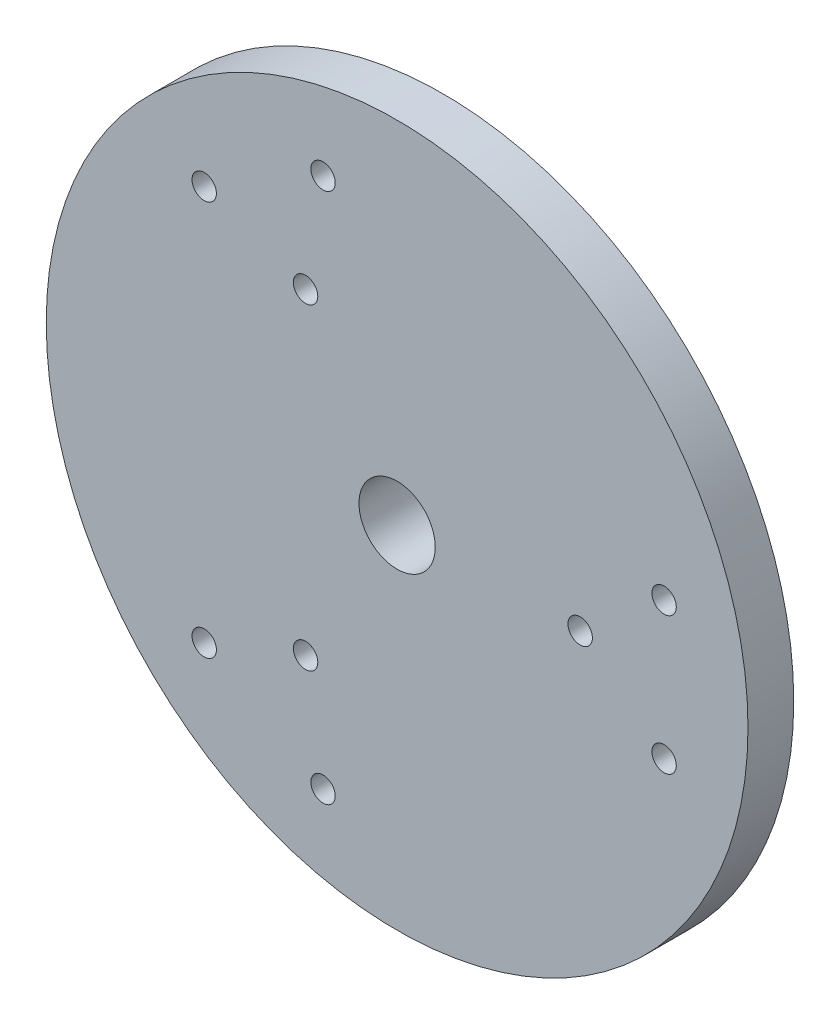
ISO-10303-21;
HEADER;
FILE_DESCRIPTION(('STEP AP214'),'2;1');
FILE_NAME('part.step','',(''),(''),'','','');
FILE_SCHEMA(('AUTOMOTIVE_DESIGN { 1 0 10303 214 1 1 1 1 }'));
ENDSEC;
DATA;
#1=APPLICATION_CONTEXT('core data for automotive mechanical design processes');
#2=APPLICATION_PROTOCOL_DEFINITION('international standard','automotive_design',2000,#1);
#3=PRODUCT_CONTEXT('',#1,'mechanical');
#4=PRODUCT('Part','Part','',(#3));
#5=PRODUCT_RELATED_PRODUCT_CATEGORY('part','',(#4));
#6=PRODUCT_DEFINITION_FORMATION('','',#4);
#7=PRODUCT_DEFINITION_CONTEXT('part definition',#1,'design');
#8=PRODUCT_DEFINITION('design','',#6,#7);
#9=PRODUCT_DEFINITION_SHAPE('','',#8);
#10=(LENGTH_UNIT() NAMED_UNIT(*) SI_UNIT(.MILLI.,.METRE.));
#11=(NAMED_UNIT(*) PLANE_ANGLE_UNIT() SI_UNIT($,.RADIAN.));
#12=(NAMED_UNIT(*) SI_UNIT($,.STERADIAN.) SOLID_ANGLE_UNIT());
#13=UNCERTAINTY_MEASURE_WITH_UNIT(LENGTH_MEASURE(1.E-05),#10,'distance_accuracy_value','');
#14=(GEOMETRIC_REPRESENTATION_CONTEXT(3) GLOBAL_UNCERTAINTY_ASSIGNED_CONTEXT((#13)) GLOBAL_UNIT_ASSIGNED_CONTEXT((#10,
#11,#12)) REPRESENTATION_CONTEXT('',''));
#15=CARTESIAN_POINT('',(0.,0.,0.));
#16=DIRECTION('',(0.,0.,1.));
#17=DIRECTION('',(1.,0.,0.));
#18=AXIS2_PLACEMENT_3D('',#15,#16,#17);
#19=CARTESIAN_POINT('',(0.,26.,24.));
#20=DIRECTION('',(0.,0.,-1.));
#21=DIRECTION('',(-1.,0.,0.));
#22=AXIS2_PLACEMENT_3D('',#19,#20,#21);
#23=CYLINDRICAL_SURFACE('',#22,46.);
#24=CARTESIAN_POINT('',(0.,26.,24.));
#25=DIRECTION('',(0.,0.,1.));
#26=DIRECTION('',(1.,0.,0.));
#27=AXIS2_PLACEMENT_3D('',#24,#25,#26);
#28=CIRCLE('',#27,46.);
#29=CARTESIAN_POINT('',(46.,26.,24.));
#30=VERTEX_POINT('',#29);
#31=EDGE_CURVE('E10',#30,#30,#28,.T.);
#32=ORIENTED_EDGE('',*,*,#31,.F.);
#33=EDGE_LOOP('',(#32));
#34=FACE_BOUND('',#33,.T.);
#35=CARTESIAN_POINT('',(0.,26.,18.));
#36=DIRECTION('',(0.,0.,1.));
#37=DIRECTION('',(1.,0.,0.));
#38=AXIS2_PLACEMENT_3D('',#35,#36,#37);
#39=CIRCLE('',#38,46.);
#40=CARTESIAN_POINT('',(46.,26.,18.));
#41=VERTEX_POINT('',#40);
#42=EDGE_CURVE('E46',#41,#41,#39,.T.);
#43=ORIENTED_EDGE('',*,*,#42,.T.);
#44=EDGE_LOOP('',(#43));
#45=FACE_BOUND('',#44,.T.);
#46=ADVANCED_FACE('F39',(#34,#45),#23,.T.);
#47=CARTESIAN_POINT('',(0.,26.,24.));
#48=DIRECTION('',(0.,0.,1.));
#49=DIRECTION('',(1.,0.,0.));
#50=AXIS2_PLACEMENT_3D('',#47,#48,#49);
#51=PLANE('',#50);
#52=CARTESIAN_POINT('',(0.,26.,24.));
#53=DIRECTION('',(0.,0.,1.));
#54=DIRECTION('',(1.,0.,0.));
#55=AXIS2_PLACEMENT_3D('',#52,#53,#54);
#56=CIRCLE('',#55,5.);
#57=CARTESIAN_POINT('',(5.,26.,24.));
#58=VERTEX_POINT('',#57);
#59=EDGE_CURVE('E116',#58,#58,#56,.T.);
#60=ORIENTED_EDGE('',*,*,#59,.F.);
#61=EDGE_LOOP('',(#60));
#62=FACE_BOUND('',#61,.T.);
#63=CARTESIAN_POINT('',(35.,35.,24.));
#64=DIRECTION('',(0.,0.,1.));
#65=DIRECTION('',(1.,0.,0.));
#66=AXIS2_PLACEMENT_3D('',#63,#64,#65);
#67=CIRCLE('',#66,1.6);
#68=CARTESIAN_POINT('',(36.6,35.,24.));
#69=VERTEX_POINT('',#68);
#70=EDGE_CURVE('E94',#69,#69,#67,.T.);
#71=ORIENTED_EDGE('',*,*,#70,.F.);
#72=EDGE_LOOP('',(#71));
#73=FACE_BOUND('',#72,.T.);
#74=CARTESIAN_POINT('',(35.,17.,24.));
#75=DIRECTION('',(0.,0.,1.));
#76=DIRECTION('',(1.,0.,0.));
#77=AXIS2_PLACEMENT_3D('',#74,#75,#76);
#78=CIRCLE('',#77,1.6);
#79=CARTESIAN_POINT('',(36.6,17.,24.));
#80=VERTEX_POINT('',#79);
#81=EDGE_CURVE('E105',#80,#80,#78,.T.);
#82=ORIENTED_EDGE('',*,*,#81,.F.);
#83=EDGE_LOOP('',(#82));
#84=FACE_BOUND('',#83,.T.);
#85=CARTESIAN_POINT('',(-12.,46.78,24.));
#86=DIRECTION('',(0.,0.,1.));
#87=DIRECTION('',(1.,0.,0.));
#88=AXIS2_PLACEMENT_3D('',#85,#86,#87);
#89=CIRCLE('',#88,1.6);
#90=CARTESIAN_POINT('',(-10.4,46.78,24.));
#91=VERTEX_POINT('',#90);
#92=EDGE_CURVE('E98',#91,#91,#89,.T.);
#93=ORIENTED_EDGE('',*,*,#92,.F.);
#94=EDGE_LOOP('',(#93));
#95=FACE_BOUND('',#94,.T.);
#96=CARTESIAN_POINT('',(-25.29,51.81,24.));
#97=DIRECTION('',(0.,0.,1.));
#98=DIRECTION('',(1.,0.,0.));
#99=AXIS2_PLACEMENT_3D('',#96,#97,#98);
#100=CIRCLE('',#99,1.6);
#101=CARTESIAN_POINT('',(-23.69,51.81,24.));
#102=VERTEX_POINT('',#101);
#103=EDGE_CURVE('E92',#102,#102,#100,.T.);
#104=ORIENTED_EDGE('',*,*,#103,.F.);
#105=EDGE_LOOP('',(#104));
#106=FACE_BOUND('',#105,.T.);
#107=CARTESIAN_POINT('',(-9.71,60.81,24.));
#108=DIRECTION('',(0.,0.,1.));
#109=DIRECTION('',(1.,0.,0.));
#110=AXIS2_PLACEMENT_3D('',#107,#108,#109);
#111=CIRCLE('',#110,1.6);
#112=CARTESIAN_POINT('',(-8.11,60.81,24.));
#113=VERTEX_POINT('',#112);
#114=EDGE_CURVE('E97',#113,#113,#111,.T.);
#115=ORIENTED_EDGE('',*,*,#114,.F.);
#116=EDGE_LOOP('',(#115));
#117=FACE_BOUND('',#116,.T.);
#118=CARTESIAN_POINT('',(-12.,5.22,24.));
#119=DIRECTION('',(0.,0.,1.));
#120=DIRECTION('',(1.,0.,0.));
#121=AXIS2_PLACEMENT_3D('',#118,#119,#120);
#122=CIRCLE('',#121,1.6);
#123=CARTESIAN_POINT('',(-10.4,5.22,24.));
#124=VERTEX_POINT('',#123);
#125=EDGE_CURVE('E114',#124,#124,#122,.T.);
#126=ORIENTED_EDGE('',*,*,#125,.F.);
#127=EDGE_LOOP('',(#126));
#128=FACE_BOUND('',#127,.T.);
#129=CARTESIAN_POINT('',(-9.71,-8.81,24.));
#130=DIRECTION('',(0.,0.,1.));
#131=DIRECTION('',(1.,0.,0.));
#132=AXIS2_PLACEMENT_3D('',#129,#130,#131);
#133=CIRCLE('',#132,1.6);
#134=CARTESIAN_POINT('',(-8.11,-8.81,24.));
#135=VERTEX_POINT('',#134);
#136=EDGE_CURVE('E109',#135,#135,#133,.T.);
#137=ORIENTED_EDGE('',*,*,#136,.F.);
#138=EDGE_LOOP('',(#137));
#139=FACE_BOUND('',#138,.T.);
#140=CARTESIAN_POINT('',(-25.29,0.,24.));
#141=DIRECTION('',(0.,0.,1.));
#142=DIRECTION('',(1.,0.,0.));
#143=AXIS2_PLACEMENT_3D('',#140,#141,#142);
#144=CIRCLE('',#143,1.6);
#145=CARTESIAN_POINT('',(-23.69,0.,24.));
#146=VERTEX_POINT('',#145);
#147=EDGE_CURVE('E110',#146,#146,#144,.T.);
#148=ORIENTED_EDGE('',*,*,#147,.F.);
#149=EDGE_LOOP('',(#148));
#150=FACE_BOUND('',#149,.T.);
#151=CARTESIAN_POINT('',(24.,26.,24.));
#152=DIRECTION('',(0.,0.,1.));
#153=DIRECTION('',(1.,0.,0.));
#154=AXIS2_PLACEMENT_3D('',#151,#152,#153);
#155=CIRCLE('',#154,1.6);
#156=CARTESIAN_POINT('',(25.6,26.,24.));
#157=VERTEX_POINT('',#156);
#158=EDGE_CURVE('E63',#157,#157,#155,.T.);
#159=ORIENTED_EDGE('',*,*,#158,.F.);
#160=EDGE_LOOP('',(#159));
#161=FACE_BOUND('',#160,.T.);
#162=ORIENTED_EDGE('',*,*,#31,.T.);
#163=EDGE_LOOP('',(#162));
#164=FACE_BOUND('',#163,.T.);
#165=ADVANCED_FACE('F148',(#62,#73,#84,#95,#106,#117,#128,#139,#150,#161,#164),#51,.T.);
#166=CARTESIAN_POINT('',(0.,26.,18.));
#167=DIRECTION('',(0.,0.,1.));
#168=DIRECTION('',(1.,0.,0.));
#169=AXIS2_PLACEMENT_3D('',#166,#167,#168);
#170=PLANE('',#169);
#171=CARTESIAN_POINT('',(35.,35.,18.));
#172=DIRECTION('',(0.,0.,1.));
#173=DIRECTION('',(1.,0.,0.));
#174=AXIS2_PLACEMENT_3D('',#171,#172,#173);
#175=CIRCLE('',#174,1.6);
#176=CARTESIAN_POINT('',(36.6,35.,18.));
#177=VERTEX_POINT('',#176);
#178=EDGE_CURVE('E83',#177,#177,#175,.F.);
#179=ORIENTED_EDGE('',*,*,#178,.F.);
#180=EDGE_LOOP('',(#179));
#181=FACE_BOUND('',#180,.T.);
#182=CARTESIAN_POINT('',(35.,17.,18.));
#183=DIRECTION('',(0.,0.,1.));
#184=DIRECTION('',(1.,0.,0.));
#185=AXIS2_PLACEMENT_3D('',#182,#183,#184);
#186=CIRCLE('',#185,1.6);
#187=CARTESIAN_POINT('',(36.6,17.,18.));
#188=VERTEX_POINT('',#187);
#189=EDGE_CURVE('E79',#188,#188,#186,.F.);
#190=ORIENTED_EDGE('',*,*,#189,.F.);
#191=EDGE_LOOP('',(#190));
#192=FACE_BOUND('',#191,.T.);
#193=CARTESIAN_POINT('',(-12.,46.78,18.));
#194=DIRECTION('',(0.,0.,1.));
#195=DIRECTION('',(1.,0.,0.));
#196=AXIS2_PLACEMENT_3D('',#193,#194,#195);
#197=CIRCLE('',#196,1.6);
#198=CARTESIAN_POINT('',(-10.4,46.78,18.));
#199=VERTEX_POINT('',#198);
#200=EDGE_CURVE('E78',#199,#199,#197,.F.);
#201=ORIENTED_EDGE('',*,*,#200,.F.);
#202=EDGE_LOOP('',(#201));
#203=FACE_BOUND('',#202,.T.);
#204=CARTESIAN_POINT('',(-25.29,51.81,18.));
#205=DIRECTION('',(0.,0.,1.));
#206=DIRECTION('',(1.,0.,0.));
#207=AXIS2_PLACEMENT_3D('',#204,#205,#206);
#208=CIRCLE('',#207,1.6);
#209=CARTESIAN_POINT('',(-23.69,51.81,18.));
#210=VERTEX_POINT('',#209);
#211=EDGE_CURVE('E71',#210,#210,#208,.F.);
#212=ORIENTED_EDGE('',*,*,#211,.F.);
#213=EDGE_LOOP('',(#212));
#214=FACE_BOUND('',#213,.T.);
#215=CARTESIAN_POINT('',(-9.71,60.81,18.));
#216=DIRECTION('',(0.,0.,1.));
#217=DIRECTION('',(1.,0.,0.));
#218=AXIS2_PLACEMENT_3D('',#215,#216,#217);
#219=CIRCLE('',#218,1.6);
#220=CARTESIAN_POINT('',(-8.11,60.81,18.));
#221=VERTEX_POINT('',#220);
#222=EDGE_CURVE('E66',#221,#221,#219,.F.);
#223=ORIENTED_EDGE('',*,*,#222,.F.);
#224=EDGE_LOOP('',(#223));
#225=FACE_BOUND('',#224,.T.);
#226=CARTESIAN_POINT('',(-12.,5.22,18.));
#227=DIRECTION('',(0.,0.,1.));
#228=DIRECTION('',(1.,0.,0.));
#229=AXIS2_PLACEMENT_3D('',#226,#227,#228);
#230=CIRCLE('',#229,1.6);
#231=CARTESIAN_POINT('',(-10.4,5.22,18.));
#232=VERTEX_POINT('',#231);
#233=EDGE_CURVE('E69',#232,#232,#230,.F.);
#234=ORIENTED_EDGE('',*,*,#233,.F.);
#235=EDGE_LOOP('',(#234));
#236=FACE_BOUND('',#235,.T.);
#237=CARTESIAN_POINT('',(-9.71,-8.81,18.));
#238=DIRECTION('',(0.,0.,1.));
#239=DIRECTION('',(1.,0.,0.));
#240=AXIS2_PLACEMENT_3D('',#237,#238,#239);
#241=CIRCLE('',#240,1.6);
#242=CARTESIAN_POINT('',(-8.11,-8.81,18.));
#243=VERTEX_POINT('',#242);
#244=EDGE_CURVE('E64',#243,#243,#241,.F.);
#245=ORIENTED_EDGE('',*,*,#244,.F.);
#246=EDGE_LOOP('',(#245));
#247=FACE_BOUND('',#246,.T.);
#248=CARTESIAN_POINT('',(-25.29,0.,18.));
#249=DIRECTION('',(0.,0.,1.));
#250=DIRECTION('',(1.,0.,0.));
#251=AXIS2_PLACEMENT_3D('',#248,#249,#250);
#252=CIRCLE('',#251,1.6);
#253=CARTESIAN_POINT('',(-23.69,0.,18.));
#254=VERTEX_POINT('',#253);
#255=EDGE_CURVE('E58',#254,#254,#252,.F.);
#256=ORIENTED_EDGE('',*,*,#255,.F.);
#257=EDGE_LOOP('',(#256));
#258=FACE_BOUND('',#257,.T.);
#259=CARTESIAN_POINT('',(24.,26.,18.));
#260=DIRECTION('',(0.,0.,1.));
#261=DIRECTION('',(1.,0.,0.));
#262=AXIS2_PLACEMENT_3D('',#259,#260,#261);
#263=CIRCLE('',#262,1.6);
#264=CARTESIAN_POINT('',(25.6,26.,18.));
#265=VERTEX_POINT('',#264);
#266=EDGE_CURVE('E60',#265,#265,#263,.F.);
#267=ORIENTED_EDGE('',*,*,#266,.F.);
#268=EDGE_LOOP('',(#267));
#269=FACE_BOUND('',#268,.T.);
#270=CARTESIAN_POINT('',(0.,26.,18.));
#271=DIRECTION('',(0.,0.,1.));
#272=DIRECTION('',(1.,0.,0.));
#273=AXIS2_PLACEMENT_3D('',#270,#271,#272);
#274=CIRCLE('',#273,14.);
#275=CARTESIAN_POINT('',(14.,26.,18.));
#276=VERTEX_POINT('',#275);
#277=EDGE_CURVE('E51',#276,#276,#274,.T.);
#278=ORIENTED_EDGE('',*,*,#277,.T.);
#279=EDGE_LOOP('',(#278));
#280=FACE_BOUND('',#279,.T.);
#281=ORIENTED_EDGE('',*,*,#42,.F.);
#282=EDGE_LOOP('',(#281));
#283=FACE_BOUND('',#282,.T.);
#284=ADVANCED_FACE('F142',(#181,#192,#203,#214,#225,#236,#247,#258,#269,#280,#283),#170,.F.);
#285=CARTESIAN_POINT('',(0.,26.,18.));
#286=DIRECTION('',(0.,0.,-1.));
#287=DIRECTION('',(-1.,0.,0.));
#288=AXIS2_PLACEMENT_3D('',#285,#286,#287);
#289=CYLINDRICAL_SURFACE('',#288,14.);
#290=ORIENTED_EDGE('',*,*,#277,.F.);
#291=EDGE_LOOP('',(#290));
#292=FACE_BOUND('',#291,.T.);
#293=CARTESIAN_POINT('',(0.,26.,12.));
#294=DIRECTION('',(0.,0.,1.));
#295=DIRECTION('',(1.,0.,0.));
#296=AXIS2_PLACEMENT_3D('',#293,#294,#295);
#297=CIRCLE('',#296,14.);
#298=CARTESIAN_POINT('',(14.,26.,12.));
#299=VERTEX_POINT('',#298);
#300=EDGE_CURVE('E53',#299,#299,#297,.T.);
#301=ORIENTED_EDGE('',*,*,#300,.T.);
#302=EDGE_LOOP('',(#301));
#303=FACE_BOUND('',#302,.T.);
#304=ADVANCED_FACE('F133',(#292,#303),#289,.T.);
#305=CARTESIAN_POINT('',(0.,26.,12.));
#306=DIRECTION('',(0.,0.,1.));
#307=DIRECTION('',(1.,0.,0.));
#308=AXIS2_PLACEMENT_3D('',#305,#306,#307);
#309=PLANE('',#308);
#310=CARTESIAN_POINT('',(0.,26.,12.));
#311=DIRECTION('',(0.,0.,1.));
#312=DIRECTION('',(1.,0.,0.));
#313=AXIS2_PLACEMENT_3D('',#310,#311,#312);
#314=CIRCLE('',#313,5.);
#315=CARTESIAN_POINT('',(5.,26.,12.));
#316=VERTEX_POINT('',#315);
#317=EDGE_CURVE('E45',#316,#316,#314,.F.);
#318=ORIENTED_EDGE('',*,*,#317,.F.);
#319=EDGE_LOOP('',(#318));
#320=FACE_BOUND('',#319,.T.);
#321=ORIENTED_EDGE('',*,*,#300,.F.);
#322=EDGE_LOOP('',(#321));
#323=FACE_BOUND('',#322,.T.);
#324=ADVANCED_FACE('F130',(#320,#323),#309,.F.);
#325=CARTESIAN_POINT('',(24.,26.,24.));
#326=DIRECTION('',(0.,0.,-1.));
#327=DIRECTION('',(-1.,0.,0.));
#328=AXIS2_PLACEMENT_3D('',#325,#326,#327);
#329=CYLINDRICAL_SURFACE('',#328,1.6);
#330=ORIENTED_EDGE('',*,*,#158,.T.);
#331=EDGE_LOOP('',(#330));
#332=FACE_BOUND('',#331,.T.);
#333=ORIENTED_EDGE('',*,*,#266,.T.);
#334=EDGE_LOOP('',(#333));
#335=FACE_BOUND('',#334,.T.);
#336=ADVANCED_FACE('F128',(#332,#335),#329,.F.);
#337=CARTESIAN_POINT('',(-25.29,0.,24.));
#338=DIRECTION('',(0.,0.,-1.));
#339=DIRECTION('',(-1.,0.,0.));
#340=AXIS2_PLACEMENT_3D('',#337,#338,#339);
#341=CYLINDRICAL_SURFACE('',#340,1.6);
#342=ORIENTED_EDGE('',*,*,#147,.T.);
#343=EDGE_LOOP('',(#342));
#344=FACE_BOUND('',#343,.T.);
#345=ORIENTED_EDGE('',*,*,#255,.T.);
#346=EDGE_LOOP('',(#345));
#347=FACE_BOUND('',#346,.T.);
#348=ADVANCED_FACE('F137',(#344,#347),#341,.F.);
#349=CARTESIAN_POINT('',(-9.71,-8.81,24.));
#350=DIRECTION('',(0.,0.,-1.));
#351=DIRECTION('',(-1.,0.,0.));
#352=AXIS2_PLACEMENT_3D('',#349,#350,#351);
#353=CYLINDRICAL_SURFACE('',#352,1.6);
#354=ORIENTED_EDGE('',*,*,#136,.T.);
#355=EDGE_LOOP('',(#354));
#356=FACE_BOUND('',#355,.T.);
#357=ORIENTED_EDGE('',*,*,#244,.T.);
#358=EDGE_LOOP('',(#357));
#359=FACE_BOUND('',#358,.T.);
#360=ADVANCED_FACE('F177',(#356,#359),#353,.F.);
#361=CARTESIAN_POINT('',(-12.,5.22,24.));
#362=DIRECTION('',(0.,0.,-1.));
#363=DIRECTION('',(-1.,0.,0.));
#364=AXIS2_PLACEMENT_3D('',#361,#362,#363);
#365=CYLINDRICAL_SURFACE('',#364,1.6);
#366=ORIENTED_EDGE('',*,*,#125,.T.);
#367=EDGE_LOOP('',(#366));
#368=FACE_BOUND('',#367,.T.);
#369=ORIENTED_EDGE('',*,*,#233,.T.);
#370=EDGE_LOOP('',(#369));
#371=FACE_BOUND('',#370,.T.);
#372=ADVANCED_FACE('F184',(#368,#371),#365,.F.);
#373=CARTESIAN_POINT('',(-9.71,60.81,24.));
#374=DIRECTION('',(0.,0.,-1.));
#375=DIRECTION('',(-1.,0.,0.));
#376=AXIS2_PLACEMENT_3D('',#373,#374,#375);
#377=CYLINDRICAL_SURFACE('',#376,1.6);
#378=ORIENTED_EDGE('',*,*,#114,.T.);
#379=EDGE_LOOP('',(#378));
#380=FACE_BOUND('',#379,.T.);
#381=ORIENTED_EDGE('',*,*,#222,.T.);
#382=EDGE_LOOP('',(#381));
#383=FACE_BOUND('',#382,.T.);
#384=ADVANCED_FACE('F201',(#380,#383),#377,.F.);
#385=CARTESIAN_POINT('',(-25.29,51.81,24.));
#386=DIRECTION('',(0.,0.,-1.));
#387=DIRECTION('',(-1.,0.,0.));
#388=AXIS2_PLACEMENT_3D('',#385,#386,#387);
#389=CYLINDRICAL_SURFACE('',#388,1.6);
#390=ORIENTED_EDGE('',*,*,#103,.T.);
#391=EDGE_LOOP('',(#390));
#392=FACE_BOUND('',#391,.T.);
#393=ORIENTED_EDGE('',*,*,#211,.T.);
#394=EDGE_LOOP('',(#393));
#395=FACE_BOUND('',#394,.T.);
#396=ADVANCED_FACE('F199',(#392,#395),#389,.F.);
#397=CARTESIAN_POINT('',(-12.,46.78,24.));
#398=DIRECTION('',(0.,0.,-1.));
#399=DIRECTION('',(-1.,0.,0.));
#400=AXIS2_PLACEMENT_3D('',#397,#398,#399);
#401=CYLINDRICAL_SURFACE('',#400,1.6);
#402=ORIENTED_EDGE('',*,*,#92,.T.);
#403=EDGE_LOOP('',(#402));
#404=FACE_BOUND('',#403,.T.);
#405=ORIENTED_EDGE('',*,*,#200,.T.);
#406=EDGE_LOOP('',(#405));
#407=FACE_BOUND('',#406,.T.);
#408=ADVANCED_FACE('F198',(#404,#407),#401,.F.);
#409=CARTESIAN_POINT('',(35.,17.,24.));
#410=DIRECTION('',(0.,0.,-1.));
#411=DIRECTION('',(-1.,0.,0.));
#412=AXIS2_PLACEMENT_3D('',#409,#410,#411);
#413=CYLINDRICAL_SURFACE('',#412,1.6);
#414=ORIENTED_EDGE('',*,*,#81,.T.);
#415=EDGE_LOOP('',(#414));
#416=FACE_BOUND('',#415,.T.);
#417=ORIENTED_EDGE('',*,*,#189,.T.);
#418=EDGE_LOOP('',(#417));
#419=FACE_BOUND('',#418,.T.);
#420=ADVANCED_FACE('F194',(#416,#419),#413,.F.);
#421=CARTESIAN_POINT('',(35.,35.,24.));
#422=DIRECTION('',(0.,0.,-1.));
#423=DIRECTION('',(-1.,0.,0.));
#424=AXIS2_PLACEMENT_3D('',#421,#422,#423);
#425=CYLINDRICAL_SURFACE('',#424,1.6);
#426=ORIENTED_EDGE('',*,*,#70,.T.);
#427=EDGE_LOOP('',(#426));
#428=FACE_BOUND('',#427,.T.);
#429=ORIENTED_EDGE('',*,*,#178,.T.);
#430=EDGE_LOOP('',(#429));
#431=FACE_BOUND('',#430,.T.);
#432=ADVANCED_FACE('F189',(#428,#431),#425,.F.);
#433=CARTESIAN_POINT('',(0.,26.,24.));
#434=DIRECTION('',(0.,0.,-1.));
#435=DIRECTION('',(-1.,0.,0.));
#436=AXIS2_PLACEMENT_3D('',#433,#434,#435);
#437=CYLINDRICAL_SURFACE('',#436,5.);
#438=ORIENTED_EDGE('',*,*,#59,.T.);
#439=EDGE_LOOP('',(#438));
#440=FACE_BOUND('',#439,.T.);
#441=ORIENTED_EDGE('',*,*,#317,.T.);
#442=EDGE_LOOP('',(#441));
#443=FACE_BOUND('',#442,.T.);
#444=ADVANCED_FACE('F121',(#440,#443),#437,.F.);
#445=CLOSED_SHELL('',(#46,#165,#284,#304,#324,#336,#348,#360,#372,#384,#396,#408,#420,#432,#444));
#446=MANIFOLD_SOLID_BREP('B2',#445);
#447=ADVANCED_BREP_SHAPE_REPRESENTATION('',(#18,#446),#14);
#448=SHAPE_DEFINITION_REPRESENTATION(#9,#447);
ENDSEC;
END-ISO-10303-21;
